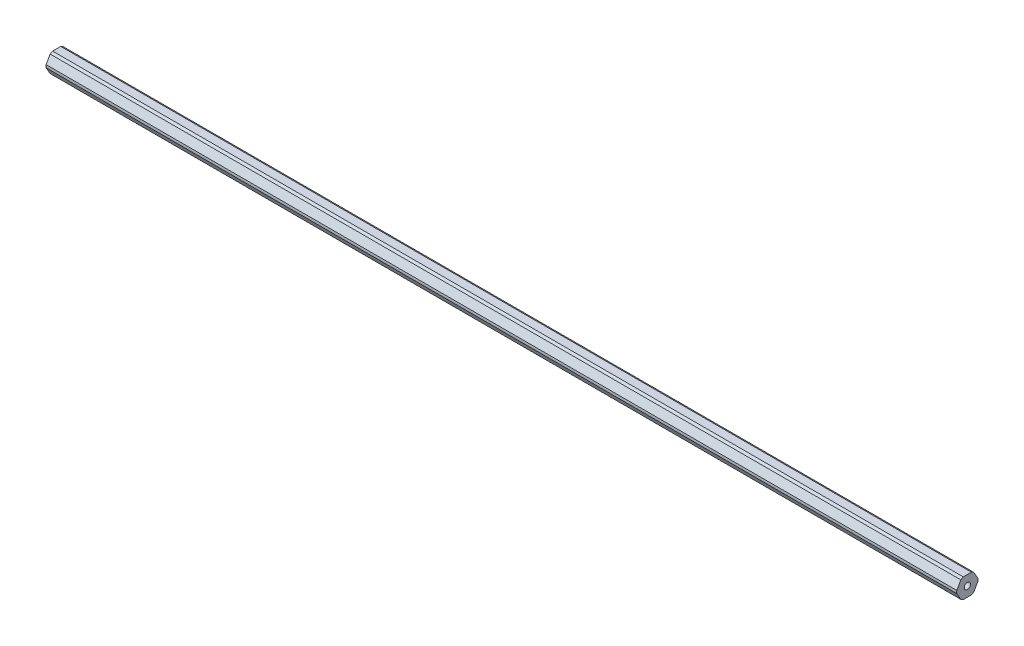
ISO-10303-21;
HEADER;
FILE_DESCRIPTION(('STEP AP214'),'2;1');
FILE_NAME('part.step','',(''),(''),'','','');
FILE_SCHEMA(('AUTOMOTIVE_DESIGN { 1 0 10303 214 1 1 1 1 }'));
ENDSEC;
DATA;
#1=APPLICATION_CONTEXT('core data for automotive mechanical design processes');
#2=APPLICATION_PROTOCOL_DEFINITION('international standard','automotive_design',2000,#1);
#3=PRODUCT_CONTEXT('',#1,'mechanical');
#4=PRODUCT('Part','Part','',(#3));
#5=PRODUCT_RELATED_PRODUCT_CATEGORY('part','',(#4));
#6=PRODUCT_DEFINITION_FORMATION('','',#4);
#7=PRODUCT_DEFINITION_CONTEXT('part definition',#1,'design');
#8=PRODUCT_DEFINITION('design','',#6,#7);
#9=PRODUCT_DEFINITION_SHAPE('','',#8);
#10=(LENGTH_UNIT() NAMED_UNIT(*) SI_UNIT(.MILLI.,.METRE.));
#11=(NAMED_UNIT(*) PLANE_ANGLE_UNIT() SI_UNIT($,.RADIAN.));
#12=(NAMED_UNIT(*) SI_UNIT($,.STERADIAN.) SOLID_ANGLE_UNIT());
#13=UNCERTAINTY_MEASURE_WITH_UNIT(LENGTH_MEASURE(1.E-05),#10,'distance_accuracy_value','');
#14=(GEOMETRIC_REPRESENTATION_CONTEXT(3) GLOBAL_UNCERTAINTY_ASSIGNED_CONTEXT((#13)) GLOBAL_UNIT_ASSIGNED_CONTEXT((#10,
#11,#12)) REPRESENTATION_CONTEXT('',''));
#15=CARTESIAN_POINT('',(0.,0.,0.));
#16=DIRECTION('',(0.,0.,1.));
#17=DIRECTION('',(1.,0.,0.));
#18=AXIS2_PLACEMENT_3D('',#15,#16,#17);
#19=CARTESIAN_POINT('',(293.6875,-110.339478800058,198.382930547476));
#20=DIRECTION('',(0.,-0.5,0.866025403784439));
#21=DIRECTION('',(0.,-0.866025403784439,-0.5));
#22=AXIS2_PLACEMENT_3D('',#19,#20,#21);
#23=PLANE('',#22);
#24=DIRECTION('',(-1.,0.,0.));
#25=VECTOR('',#24,1.);
#26=CARTESIAN_POINT('',(293.6875,-112.620297442514,197.066099290282));
#27=LINE('',#26,#25);
#28=CARTESIAN_POINT('',(293.6875,-112.620297442514,197.066099290282));
#29=VERTEX_POINT('',#28);
#30=CARTESIAN_POINT('',(-293.6875,-112.620297442514,197.066099290282));
#31=VERTEX_POINT('',#30);
#32=EDGE_CURVE('E183',#29,#31,#27,.T.);
#33=ORIENTED_EDGE('',*,*,#32,.T.);
#34=DIRECTION('',(0.,-0.866025403784437,-0.5));
#35=VECTOR('',#34,1.);
#36=CARTESIAN_POINT('',(-293.6875,-110.339478800058,198.382930547476));
#37=LINE('',#36,#35);
#38=CARTESIAN_POINT('',(-293.6875,-108.058660157602,199.699761804671));
#39=VERTEX_POINT('',#38);
#40=EDGE_CURVE('E143',#39,#31,#37,.T.);
#41=ORIENTED_EDGE('',*,*,#40,.F.);
#42=DIRECTION('',(-1.,0.,0.));
#43=VECTOR('',#42,1.);
#44=CARTESIAN_POINT('',(293.6875,-108.058660157602,199.699761804671));
#45=LINE('',#44,#43);
#46=CARTESIAN_POINT('',(293.6875,-108.058660157602,199.699761804671));
#47=VERTEX_POINT('',#46);
#48=EDGE_CURVE('E186',#39,#47,#45,.F.);
#49=ORIENTED_EDGE('',*,*,#48,.T.);
#50=DIRECTION('',(0.,0.866025403784439,0.5));
#51=VECTOR('',#50,1.);
#52=CARTESIAN_POINT('',(293.6875,-110.339478800058,198.382930547476));
#53=LINE('',#52,#51);
#54=EDGE_CURVE('E194',#29,#47,#53,.T.);
#55=ORIENTED_EDGE('',*,*,#54,.F.);
#56=EDGE_LOOP('',(#33,#41,#49,#55));
#57=FACE_BOUND('',#56,.T.);
#58=ADVANCED_FACE('F17',(#57),#23,.F.);
#59=CARTESIAN_POINT('',(293.6875,-107.164205317336,203.882665547477));
#60=DIRECTION('',(0.,-1.,0.));
#61=DIRECTION('',(0.,0.,-1.));
#62=AXIS2_PLACEMENT_3D('',#59,#60,#61);
#63=PLANE('',#62);
#64=DIRECTION('',(-1.,0.,0.));
#65=VECTOR('',#64,1.);
#66=CARTESIAN_POINT('',(293.6875,-107.164205317336,201.249003033087));
#67=LINE('',#66,#65);
#68=CARTESIAN_POINT('',(293.6875,-107.164205317336,201.249003033087));
#69=VERTEX_POINT('',#68);
#70=CARTESIAN_POINT('',(-293.6875,-107.164205317336,201.249003033087));
#71=VERTEX_POINT('',#70);
#72=EDGE_CURVE('E118',#69,#71,#67,.T.);
#73=ORIENTED_EDGE('',*,*,#72,.T.);
#74=DIRECTION('',(0.,0.,-1.));
#75=VECTOR('',#74,1.);
#76=CARTESIAN_POINT('',(-293.6875,-107.164205317336,203.882665547477));
#77=LINE('',#76,#75);
#78=CARTESIAN_POINT('',(-293.6875,-107.164205317336,206.516328061866));
#79=VERTEX_POINT('',#78);
#80=EDGE_CURVE('E136',#79,#71,#77,.T.);
#81=ORIENTED_EDGE('',*,*,#80,.F.);
#82=DIRECTION('',(-1.,0.,0.));
#83=VECTOR('',#82,1.);
#84=CARTESIAN_POINT('',(293.6875,-107.164205317336,206.516328061866));
#85=LINE('',#84,#83);
#86=CARTESIAN_POINT('',(293.6875,-107.164205317336,206.516328061866));
#87=VERTEX_POINT('',#86);
#88=EDGE_CURVE('E179',#79,#87,#85,.F.);
#89=ORIENTED_EDGE('',*,*,#88,.T.);
#90=DIRECTION('',(0.,0.,1.));
#91=VECTOR('',#90,1.);
#92=CARTESIAN_POINT('',(293.6875,-107.164205317336,203.882665547477));
#93=LINE('',#92,#91);
#94=EDGE_CURVE('E198',#69,#87,#93,.T.);
#95=ORIENTED_EDGE('',*,*,#94,.F.);
#96=EDGE_LOOP('',(#73,#81,#89,#95));
#97=FACE_BOUND('',#96,.T.);
#98=ADVANCED_FACE('F253',(#97),#63,.F.);
#99=CARTESIAN_POINT('',(293.6875,-110.339478800058,209.382400547476));
#100=DIRECTION('',(0.,-0.5,-0.866025403784439));
#101=DIRECTION('',(0.,0.866025403784439,-0.5));
#102=AXIS2_PLACEMENT_3D('',#99,#100,#101);
#103=PLANE('',#102);
#104=DIRECTION('',(-1.,0.,0.));
#105=VECTOR('',#104,1.);
#106=CARTESIAN_POINT('',(293.6875,-108.058660157602,208.065569290282));
#107=LINE('',#106,#105);
#108=CARTESIAN_POINT('',(293.6875,-108.058660157602,208.065569290282));
#109=VERTEX_POINT('',#108);
#110=CARTESIAN_POINT('',(-293.6875,-108.058660157602,208.065569290282));
#111=VERTEX_POINT('',#110);
#112=EDGE_CURVE('E119',#109,#111,#107,.T.);
#113=ORIENTED_EDGE('',*,*,#112,.T.);
#114=DIRECTION('',(0.,0.866025403784439,-0.5));
#115=VECTOR('',#114,1.);
#116=CARTESIAN_POINT('',(-293.6875,-110.339478800058,209.382400547476));
#117=LINE('',#116,#115);
#118=CARTESIAN_POINT('',(-293.6875,-112.620297442514,210.699231804671));
#119=VERTEX_POINT('',#118);
#120=EDGE_CURVE('E125',#119,#111,#117,.T.);
#121=ORIENTED_EDGE('',*,*,#120,.F.);
#122=DIRECTION('',(-1.,0.,0.));
#123=VECTOR('',#122,1.);
#124=CARTESIAN_POINT('',(293.6875,-112.620297442514,210.699231804671));
#125=LINE('',#124,#123);
#126=CARTESIAN_POINT('',(293.6875,-112.620297442514,210.699231804671));
#127=VERTEX_POINT('',#126);
#128=EDGE_CURVE('E106',#119,#127,#125,.F.);
#129=ORIENTED_EDGE('',*,*,#128,.T.);
#130=DIRECTION('',(0.,-0.866025403784439,0.5));
#131=VECTOR('',#130,1.);
#132=CARTESIAN_POINT('',(293.6875,-110.339478800058,209.382400547476));
#133=LINE('',#132,#131);
#134=EDGE_CURVE('E202',#109,#127,#133,.T.);
#135=ORIENTED_EDGE('',*,*,#134,.F.);
#136=EDGE_LOOP('',(#113,#121,#129,#135));
#137=FACE_BOUND('',#136,.T.);
#138=ADVANCED_FACE('F133',(#137),#103,.F.);
#139=CARTESIAN_POINT('',(293.6875,-116.690025765501,209.382400547476));
#140=DIRECTION('',(0.,0.5,-0.866025403784439));
#141=DIRECTION('',(0.,0.866025403784439,0.5));
#142=AXIS2_PLACEMENT_3D('',#139,#140,#141);
#143=PLANE('',#142);
#144=DIRECTION('',(-1.,0.,0.));
#145=VECTOR('',#144,1.);
#146=CARTESIAN_POINT('',(293.6875,-114.409207123045,210.699231804671));
#147=LINE('',#146,#145);
#148=CARTESIAN_POINT('',(293.6875,-114.409207123045,210.699231804671));
#149=VERTEX_POINT('',#148);
#150=CARTESIAN_POINT('',(-293.6875,-114.409207123045,210.699231804671));
#151=VERTEX_POINT('',#150);
#152=EDGE_CURVE('E168',#149,#151,#147,.T.);
#153=ORIENTED_EDGE('',*,*,#152,.T.);
#154=DIRECTION('',(0.,0.866025403784439,0.5));
#155=VECTOR('',#154,1.);
#156=CARTESIAN_POINT('',(-293.6875,-116.690025765501,209.382400547476));
#157=LINE('',#156,#155);
#158=CARTESIAN_POINT('',(-293.6875,-118.970844407957,208.065569290282));
#159=VERTEX_POINT('',#158);
#160=EDGE_CURVE('E128',#159,#151,#157,.T.);
#161=ORIENTED_EDGE('',*,*,#160,.F.);
#162=DIRECTION('',(-1.,0.,0.));
#163=VECTOR('',#162,1.);
#164=CARTESIAN_POINT('',(293.6875,-118.970844407957,208.065569290282));
#165=LINE('',#164,#163);
#166=CARTESIAN_POINT('',(293.6875,-118.970844407957,208.065569290282));
#167=VERTEX_POINT('',#166);
#168=EDGE_CURVE('E171',#159,#167,#165,.F.);
#169=ORIENTED_EDGE('',*,*,#168,.T.);
#170=DIRECTION('',(0.,-0.866025403784439,-0.5));
#171=VECTOR('',#170,1.);
#172=CARTESIAN_POINT('',(293.6875,-116.690025765501,209.382400547476));
#173=LINE('',#172,#171);
#174=EDGE_CURVE('E205',#149,#167,#173,.T.);
#175=ORIENTED_EDGE('',*,*,#174,.F.);
#176=EDGE_LOOP('',(#153,#161,#169,#175));
#177=FACE_BOUND('',#176,.T.);
#178=ADVANCED_FACE('F283',(#177),#143,.F.);
#179=CARTESIAN_POINT('',(293.6875,-119.865299248223,203.882665547477));
#180=DIRECTION('',(0.,1.,0.));
#181=DIRECTION('',(0.,0.,1.));
#182=AXIS2_PLACEMENT_3D('',#179,#180,#181);
#183=PLANE('',#182);
#184=DIRECTION('',(-1.,0.,0.));
#185=VECTOR('',#184,1.);
#186=CARTESIAN_POINT('',(293.6875,-119.865299248223,206.516328061866));
#187=LINE('',#186,#185);
#188=CARTESIAN_POINT('',(293.6875,-119.865299248223,206.516328061866));
#189=VERTEX_POINT('',#188);
#190=CARTESIAN_POINT('',(-293.6875,-119.865299248223,206.516328061866));
#191=VERTEX_POINT('',#190);
#192=EDGE_CURVE('E162',#189,#191,#187,.T.);
#193=ORIENTED_EDGE('',*,*,#192,.T.);
#194=DIRECTION('',(0.,0.,1.));
#195=VECTOR('',#194,1.);
#196=CARTESIAN_POINT('',(-293.6875,-119.865299248223,203.882665547477));
#197=LINE('',#196,#195);
#198=CARTESIAN_POINT('',(-293.6875,-119.865299248223,201.249003033087));
#199=VERTEX_POINT('',#198);
#200=EDGE_CURVE('E146',#199,#191,#197,.T.);
#201=ORIENTED_EDGE('',*,*,#200,.F.);
#202=DIRECTION('',(-1.,0.,0.));
#203=VECTOR('',#202,1.);
#204=CARTESIAN_POINT('',(293.6875,-119.865299248223,201.249003033087));
#205=LINE('',#204,#203);
#206=CARTESIAN_POINT('',(293.6875,-119.865299248223,201.249003033087));
#207=VERTEX_POINT('',#206);
#208=EDGE_CURVE('E165',#199,#207,#205,.F.);
#209=ORIENTED_EDGE('',*,*,#208,.T.);
#210=DIRECTION('',(0.,0.,-1.));
#211=VECTOR('',#210,1.);
#212=CARTESIAN_POINT('',(293.6875,-119.865299248223,203.882665547477));
#213=LINE('',#212,#211);
#214=EDGE_CURVE('E25',#189,#207,#213,.T.);
#215=ORIENTED_EDGE('',*,*,#214,.F.);
#216=EDGE_LOOP('',(#193,#201,#209,#215));
#217=FACE_BOUND('',#216,.T.);
#218=ADVANCED_FACE('F217',(#217),#183,.F.);
#219=CARTESIAN_POINT('',(293.6875,-116.690025765501,198.382930547476));
#220=DIRECTION('',(0.,0.5,0.866025403784437));
#221=DIRECTION('',(0.,-0.866025403784437,0.5));
#222=AXIS2_PLACEMENT_3D('',#219,#220,#221);
#223=PLANE('',#222);
#224=DIRECTION('',(-1.,0.,0.));
#225=VECTOR('',#224,1.);
#226=CARTESIAN_POINT('',(293.6875,-118.970844407957,199.699761804671));
#227=LINE('',#226,#225);
#228=CARTESIAN_POINT('',(293.6875,-118.970844407957,199.699761804671));
#229=VERTEX_POINT('',#228);
#230=CARTESIAN_POINT('',(-293.6875,-118.970844407957,199.699761804671));
#231=VERTEX_POINT('',#230);
#232=EDGE_CURVE('E40',#229,#231,#227,.T.);
#233=ORIENTED_EDGE('',*,*,#232,.T.);
#234=DIRECTION('',(0.,-0.866025403784439,0.5));
#235=VECTOR('',#234,1.);
#236=CARTESIAN_POINT('',(-293.6875,-116.690025765501,198.382930547476));
#237=LINE('',#236,#235);
#238=CARTESIAN_POINT('',(-293.6875,-114.409207123045,197.066099290282));
#239=VERTEX_POINT('',#238);
#240=EDGE_CURVE('E227',#239,#231,#237,.T.);
#241=ORIENTED_EDGE('',*,*,#240,.F.);
#242=DIRECTION('',(-1.,0.,0.));
#243=VECTOR('',#242,1.);
#244=CARTESIAN_POINT('',(293.6875,-114.409207123045,197.066099290282));
#245=LINE('',#244,#243);
#246=CARTESIAN_POINT('',(293.6875,-114.409207123045,197.066099290282));
#247=VERTEX_POINT('',#246);
#248=EDGE_CURVE('E159',#239,#247,#245,.F.);
#249=ORIENTED_EDGE('',*,*,#248,.T.);
#250=DIRECTION('',(0.,0.866025403784437,-0.5));
#251=VECTOR('',#250,1.);
#252=CARTESIAN_POINT('',(293.6875,-116.690025765501,198.382930547476));
#253=LINE('',#252,#251);
#254=EDGE_CURVE('E11',#229,#247,#253,.T.);
#255=ORIENTED_EDGE('',*,*,#254,.F.);
#256=EDGE_LOOP('',(#233,#241,#249,#255));
#257=FACE_BOUND('',#256,.T.);
#258=ADVANCED_FACE('F261',(#257),#223,.F.);
#259=CARTESIAN_POINT('',(293.6875,-113.514752282779,203.882665547477));
#260=DIRECTION('',(1.,0.,0.));
#261=DIRECTION('',(0.,0.,-1.));
#262=AXIS2_PLACEMENT_3D('',#259,#260,#261);
#263=PLANE('',#262);
#264=CARTESIAN_POINT('',(293.6875,-113.514752282779,203.882665547477));
#265=DIRECTION('',(1.,0.,0.));
#266=DIRECTION('',(0.,0.,-1.));
#267=AXIS2_PLACEMENT_3D('',#264,#265,#266);
#268=CIRCLE('',#267,2.);
#269=CARTESIAN_POINT('',(293.6875,-113.514752282779,201.882665547477));
#270=VERTEX_POINT('',#269);
#271=EDGE_CURVE('E190',#270,#270,#268,.T.);
#272=ORIENTED_EDGE('',*,*,#271,.F.);
#273=EDGE_LOOP('',(#272));
#274=FACE_BOUND('',#273,.T.);
#275=ORIENTED_EDGE('',*,*,#54,.T.);
#276=CARTESIAN_POINT('',(293.6875,-113.514752282779,203.882665547477));
#277=DIRECTION('',(1.,0.,0.));
#278=DIRECTION('',(0.,0.,-1.));
#279=AXIS2_PLACEMENT_3D('',#276,#277,#278);
#280=CIRCLE('',#279,6.875);
#281=EDGE_CURVE('E156',#47,#69,#280,.T.);
#282=ORIENTED_EDGE('',*,*,#281,.T.);
#283=ORIENTED_EDGE('',*,*,#94,.T.);
#284=EDGE_CURVE('E244',#87,#109,#280,.T.);
#285=ORIENTED_EDGE('',*,*,#284,.T.);
#286=ORIENTED_EDGE('',*,*,#134,.T.);
#287=EDGE_CURVE('E112',#127,#149,#280,.T.);
#288=ORIENTED_EDGE('',*,*,#287,.T.);
#289=ORIENTED_EDGE('',*,*,#174,.T.);
#290=EDGE_CURVE('E215',#167,#189,#280,.T.);
#291=ORIENTED_EDGE('',*,*,#290,.T.);
#292=ORIENTED_EDGE('',*,*,#214,.T.);
#293=EDGE_CURVE('E155',#207,#229,#280,.T.);
#294=ORIENTED_EDGE('',*,*,#293,.T.);
#295=ORIENTED_EDGE('',*,*,#254,.T.);
#296=EDGE_CURVE('E32',#247,#29,#280,.T.);
#297=ORIENTED_EDGE('',*,*,#296,.T.);
#298=EDGE_LOOP('',(#275,#282,#283,#285,#286,#288,#289,#291,#292,#294,#295,#297));
#299=FACE_BOUND('',#298,.T.);
#300=ADVANCED_FACE('F213',(#274,#299),#263,.T.);
#301=CARTESIAN_POINT('',(293.6875,-113.514752282779,203.882665547477));
#302=DIRECTION('',(-1.,0.,0.));
#303=DIRECTION('',(0.,0.,1.));
#304=AXIS2_PLACEMENT_3D('',#301,#302,#303);
#305=CYLINDRICAL_SURFACE('',#304,2.);
#306=ORIENTED_EDGE('',*,*,#271,.T.);
#307=EDGE_LOOP('',(#306));
#308=FACE_BOUND('',#307,.T.);
#309=CARTESIAN_POINT('',(-293.6875,-113.514752282779,203.882665547477));
#310=DIRECTION('',(-1.,0.,0.));
#311=DIRECTION('',(0.,0.,1.));
#312=AXIS2_PLACEMENT_3D('',#309,#310,#311);
#313=CIRCLE('',#312,2.);
#314=CARTESIAN_POINT('',(-293.6875,-113.514752282779,205.882665547477));
#315=VERTEX_POINT('',#314);
#316=EDGE_CURVE('E234',#315,#315,#313,.T.);
#317=ORIENTED_EDGE('',*,*,#316,.T.);
#318=EDGE_LOOP('',(#317));
#319=FACE_BOUND('',#318,.T.);
#320=ADVANCED_FACE('F273',(#308,#319),#305,.F.);
#321=CARTESIAN_POINT('',(293.6875,-113.514752282779,203.882665547477));
#322=DIRECTION('',(-1.,0.,0.));
#323=DIRECTION('',(0.,0.,1.));
#324=AXIS2_PLACEMENT_3D('',#321,#322,#323);
#325=CYLINDRICAL_SURFACE('',#324,6.875);
#326=ORIENTED_EDGE('',*,*,#208,.F.);
#327=CARTESIAN_POINT('',(-293.6875,-113.514752282779,203.882665547477));
#328=DIRECTION('',(-1.,0.,0.));
#329=DIRECTION('',(0.,0.,1.));
#330=AXIS2_PLACEMENT_3D('',#327,#328,#329);
#331=CIRCLE('',#330,6.875);
#332=EDGE_CURVE('E223',#231,#199,#331,.T.);
#333=ORIENTED_EDGE('',*,*,#332,.F.);
#334=ORIENTED_EDGE('',*,*,#232,.F.);
#335=ORIENTED_EDGE('',*,*,#293,.F.);
#336=EDGE_LOOP('',(#326,#333,#334,#335));
#337=FACE_BOUND('',#336,.T.);
#338=ADVANCED_FACE('F222',(#337),#325,.T.);
#339=ORIENTED_EDGE('',*,*,#296,.F.);
#340=ORIENTED_EDGE('',*,*,#248,.F.);
#341=EDGE_CURVE('E229',#31,#239,#331,.T.);
#342=ORIENTED_EDGE('',*,*,#341,.F.);
#343=ORIENTED_EDGE('',*,*,#32,.F.);
#344=EDGE_LOOP('',(#339,#340,#342,#343));
#345=FACE_BOUND('',#344,.T.);
#346=ADVANCED_FACE('F263',(#345),#325,.T.);
#347=ORIENTED_EDGE('',*,*,#168,.F.);
#348=EDGE_CURVE('E130',#191,#159,#331,.T.);
#349=ORIENTED_EDGE('',*,*,#348,.F.);
#350=ORIENTED_EDGE('',*,*,#192,.F.);
#351=ORIENTED_EDGE('',*,*,#290,.F.);
#352=EDGE_LOOP('',(#347,#349,#350,#351));
#353=FACE_BOUND('',#352,.T.);
#354=ADVANCED_FACE('F265',(#353),#325,.T.);
#355=ORIENTED_EDGE('',*,*,#128,.F.);
#356=EDGE_CURVE('E109',#151,#119,#331,.T.);
#357=ORIENTED_EDGE('',*,*,#356,.F.);
#358=ORIENTED_EDGE('',*,*,#152,.F.);
#359=ORIENTED_EDGE('',*,*,#287,.F.);
#360=EDGE_LOOP('',(#355,#357,#358,#359));
#361=FACE_BOUND('',#360,.T.);
#362=ADVANCED_FACE('F108',(#361),#325,.T.);
#363=ORIENTED_EDGE('',*,*,#88,.F.);
#364=EDGE_CURVE('E132',#111,#79,#331,.T.);
#365=ORIENTED_EDGE('',*,*,#364,.F.);
#366=ORIENTED_EDGE('',*,*,#112,.F.);
#367=ORIENTED_EDGE('',*,*,#284,.F.);
#368=EDGE_LOOP('',(#363,#365,#366,#367));
#369=FACE_BOUND('',#368,.T.);
#370=ADVANCED_FACE('F267',(#369),#325,.T.);
#371=ORIENTED_EDGE('',*,*,#48,.F.);
#372=EDGE_CURVE('E231',#71,#39,#331,.T.);
#373=ORIENTED_EDGE('',*,*,#372,.F.);
#374=ORIENTED_EDGE('',*,*,#72,.F.);
#375=ORIENTED_EDGE('',*,*,#281,.F.);
#376=EDGE_LOOP('',(#371,#373,#374,#375));
#377=FACE_BOUND('',#376,.T.);
#378=ADVANCED_FACE('F257',(#377),#325,.T.);
#379=CARTESIAN_POINT('',(-293.6875,-113.514752282779,203.882665547477));
#380=DIRECTION('',(-1.,0.,0.));
#381=DIRECTION('',(0.,0.,-1.));
#382=AXIS2_PLACEMENT_3D('',#379,#380,#381);
#383=PLANE('',#382);
#384=ORIENTED_EDGE('',*,*,#316,.F.);
#385=EDGE_LOOP('',(#384));
#386=FACE_BOUND('',#385,.T.);
#387=ORIENTED_EDGE('',*,*,#120,.T.);
#388=ORIENTED_EDGE('',*,*,#364,.T.);
#389=ORIENTED_EDGE('',*,*,#80,.T.);
#390=ORIENTED_EDGE('',*,*,#372,.T.);
#391=ORIENTED_EDGE('',*,*,#40,.T.);
#392=ORIENTED_EDGE('',*,*,#341,.T.);
#393=ORIENTED_EDGE('',*,*,#240,.T.);
#394=ORIENTED_EDGE('',*,*,#332,.T.);
#395=ORIENTED_EDGE('',*,*,#200,.T.);
#396=ORIENTED_EDGE('',*,*,#348,.T.);
#397=ORIENTED_EDGE('',*,*,#160,.T.);
#398=ORIENTED_EDGE('',*,*,#356,.T.);
#399=EDGE_LOOP('',(#387,#388,#389,#390,#391,#392,#393,#394,#395,#396,#397,#398));
#400=FACE_BOUND('',#399,.T.);
#401=ADVANCED_FACE('F123',(#386,#400),#383,.T.);
#402=CLOSED_SHELL('',(#58,#98,#138,#178,#218,#258,#300,#320,#338,#346,#354,#362,#370,#378,#401));
#403=MANIFOLD_SOLID_BREP('B1',#402);
#404=ADVANCED_BREP_SHAPE_REPRESENTATION('',(#18,#403),#14);
#405=SHAPE_DEFINITION_REPRESENTATION(#9,#404);
ENDSEC;
END-ISO-10303-21;
